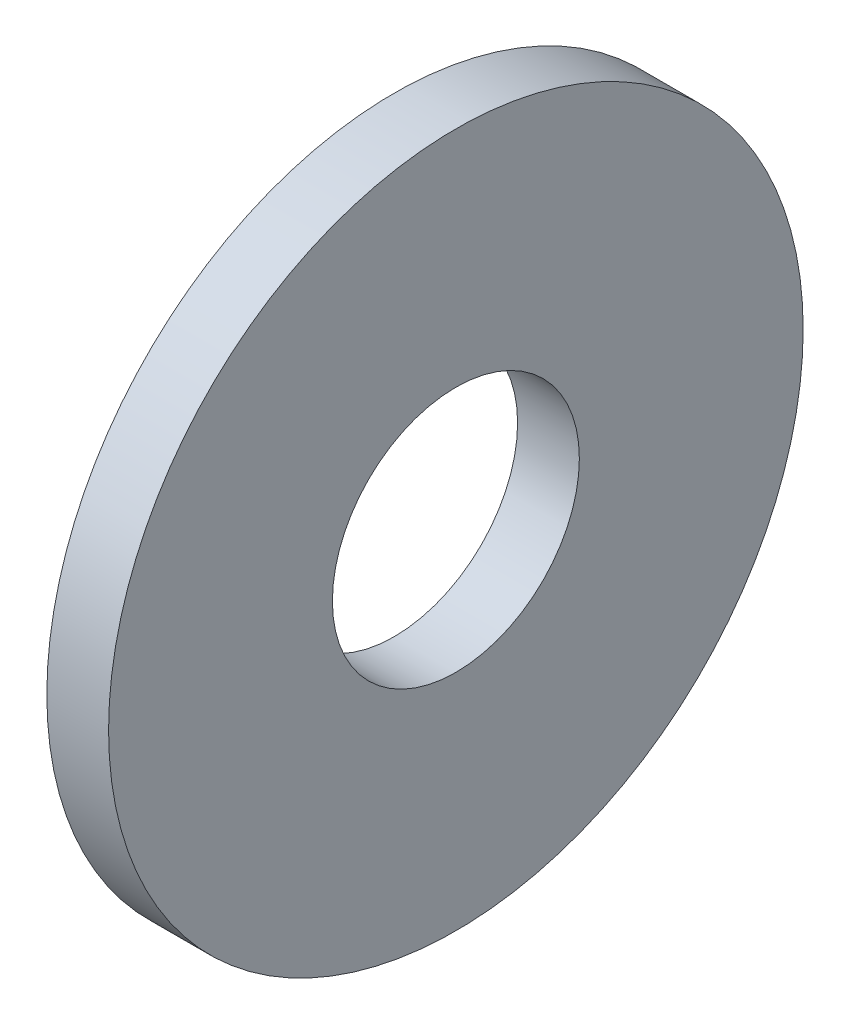
ISO-10303-21;
HEADER;
FILE_DESCRIPTION(('STEP AP214'),'2;1');
FILE_NAME('part.step','',(''),(''),'','','');
FILE_SCHEMA(('AUTOMOTIVE_DESIGN { 1 0 10303 214 1 1 1 1 }'));
ENDSEC;
DATA;
#1=APPLICATION_CONTEXT('core data for automotive mechanical design processes');
#2=APPLICATION_PROTOCOL_DEFINITION('international standard','automotive_design',2000,#1);
#3=PRODUCT_CONTEXT('',#1,'mechanical');
#4=PRODUCT('Part','Part','',(#3));
#5=PRODUCT_RELATED_PRODUCT_CATEGORY('part','',(#4));
#6=PRODUCT_DEFINITION_FORMATION('','',#4);
#7=PRODUCT_DEFINITION_CONTEXT('part definition',#1,'design');
#8=PRODUCT_DEFINITION('design','',#6,#7);
#9=PRODUCT_DEFINITION_SHAPE('','',#8);
#10=(LENGTH_UNIT() NAMED_UNIT(*) SI_UNIT(.MILLI.,.METRE.));
#11=(NAMED_UNIT(*) PLANE_ANGLE_UNIT() SI_UNIT($,.RADIAN.));
#12=(NAMED_UNIT(*) SI_UNIT($,.STERADIAN.) SOLID_ANGLE_UNIT());
#13=UNCERTAINTY_MEASURE_WITH_UNIT(LENGTH_MEASURE(1.E-05),#10,'distance_accuracy_value','');
#14=(GEOMETRIC_REPRESENTATION_CONTEXT(3) GLOBAL_UNCERTAINTY_ASSIGNED_CONTEXT((#13)) GLOBAL_UNIT_ASSIGNED_CONTEXT((#10,
#11,#12)) REPRESENTATION_CONTEXT('',''));
#15=CARTESIAN_POINT('',(0.,0.,0.));
#16=DIRECTION('',(0.,0.,1.));
#17=DIRECTION('',(1.,0.,0.));
#18=AXIS2_PLACEMENT_3D('',#15,#16,#17);
#19=CARTESIAN_POINT('',(-34.9249999999999,0.,0.));
#20=DIRECTION('',(-1.,0.,0.));
#21=DIRECTION('',(0.,0.,1.));
#22=AXIS2_PLACEMENT_3D('',#19,#20,#21);
#23=CYLINDRICAL_SURFACE('',#22,1.6);
#24=CARTESIAN_POINT('',(0.,0.,0.));
#25=DIRECTION('',(-1.,0.,0.));
#26=DIRECTION('',(0.,0.,1.));
#27=AXIS2_PLACEMENT_3D('',#24,#25,#26);
#28=CIRCLE('',#27,1.6);
#29=CARTESIAN_POINT('',(0.,0.,1.6));
#30=VERTEX_POINT('',#29);
#31=EDGE_CURVE('E10',#30,#30,#28,.T.);
#32=ORIENTED_EDGE('',*,*,#31,.F.);
#33=EDGE_LOOP('',(#32));
#34=FACE_BOUND('',#33,.T.);
#35=CARTESIAN_POINT('',(-0.800000000000002,0.,0.));
#36=DIRECTION('',(-1.,0.,0.));
#37=DIRECTION('',(0.,0.,1.));
#38=AXIS2_PLACEMENT_3D('',#35,#36,#37);
#39=CIRCLE('',#38,1.6);
#40=CARTESIAN_POINT('',(-0.800000000000002,0.,1.6));
#41=VERTEX_POINT('',#40);
#42=EDGE_CURVE('E51',#41,#41,#39,.T.);
#43=ORIENTED_EDGE('',*,*,#42,.T.);
#44=EDGE_LOOP('',(#43));
#45=FACE_BOUND('',#44,.T.);
#46=ADVANCED_FACE('F37',(#34,#45),#23,.F.);
#47=CARTESIAN_POINT('',(0.,1.6,0.));
#48=DIRECTION('',(-1.,0.,0.));
#49=DIRECTION('',(0.,0.,1.));
#50=AXIS2_PLACEMENT_3D('',#47,#48,#49);
#51=PLANE('',#50);
#52=CARTESIAN_POINT('',(0.,0.,0.));
#53=DIRECTION('',(-1.,0.,0.));
#54=DIRECTION('',(0.,0.,1.));
#55=AXIS2_PLACEMENT_3D('',#52,#53,#54);
#56=CIRCLE('',#55,4.5);
#57=CARTESIAN_POINT('',(0.,0.,4.5));
#58=VERTEX_POINT('',#57);
#59=EDGE_CURVE('E43',#58,#58,#56,.T.);
#60=ORIENTED_EDGE('',*,*,#59,.F.);
#61=EDGE_LOOP('',(#60));
#62=FACE_BOUND('',#61,.T.);
#63=ORIENTED_EDGE('',*,*,#31,.T.);
#64=EDGE_LOOP('',(#63));
#65=FACE_BOUND('',#64,.T.);
#66=ADVANCED_FACE('F66',(#62,#65),#51,.F.);
#67=CARTESIAN_POINT('',(-34.9249999999999,0.,0.));
#68=DIRECTION('',(-1.,0.,0.));
#69=DIRECTION('',(0.,0.,1.));
#70=AXIS2_PLACEMENT_3D('',#67,#68,#69);
#71=CYLINDRICAL_SURFACE('',#70,4.5);
#72=CARTESIAN_POINT('',(-0.800000000000002,0.,0.));
#73=DIRECTION('',(-1.,0.,0.));
#74=DIRECTION('',(0.,0.,1.));
#75=AXIS2_PLACEMENT_3D('',#72,#73,#74);
#76=CIRCLE('',#75,4.5);
#77=CARTESIAN_POINT('',(-0.800000000000002,0.,4.5));
#78=VERTEX_POINT('',#77);
#79=EDGE_CURVE('E47',#78,#78,#76,.T.);
#80=ORIENTED_EDGE('',*,*,#79,.F.);
#81=EDGE_LOOP('',(#80));
#82=FACE_BOUND('',#81,.T.);
#83=ORIENTED_EDGE('',*,*,#59,.T.);
#84=EDGE_LOOP('',(#83));
#85=FACE_BOUND('',#84,.T.);
#86=ADVANCED_FACE('F61',(#82,#85),#71,.T.);
#87=CARTESIAN_POINT('',(-0.800000000000001,4.5,0.));
#88=DIRECTION('',(1.,0.,0.));
#89=DIRECTION('',(0.,0.,-1.));
#90=AXIS2_PLACEMENT_3D('',#87,#88,#89);
#91=PLANE('',#90);
#92=ORIENTED_EDGE('',*,*,#42,.F.);
#93=EDGE_LOOP('',(#92));
#94=FACE_BOUND('',#93,.T.);
#95=ORIENTED_EDGE('',*,*,#79,.T.);
#96=EDGE_LOOP('',(#95));
#97=FACE_BOUND('',#96,.T.);
#98=ADVANCED_FACE('F58',(#94,#97),#91,.F.);
#99=CLOSED_SHELL('',(#46,#66,#86,#98));
#100=MANIFOLD_SOLID_BREP('B2',#99);
#101=ADVANCED_BREP_SHAPE_REPRESENTATION('',(#18,#100),#14);
#102=SHAPE_DEFINITION_REPRESENTATION(#9,#101);
ENDSEC;
END-ISO-10303-21;
